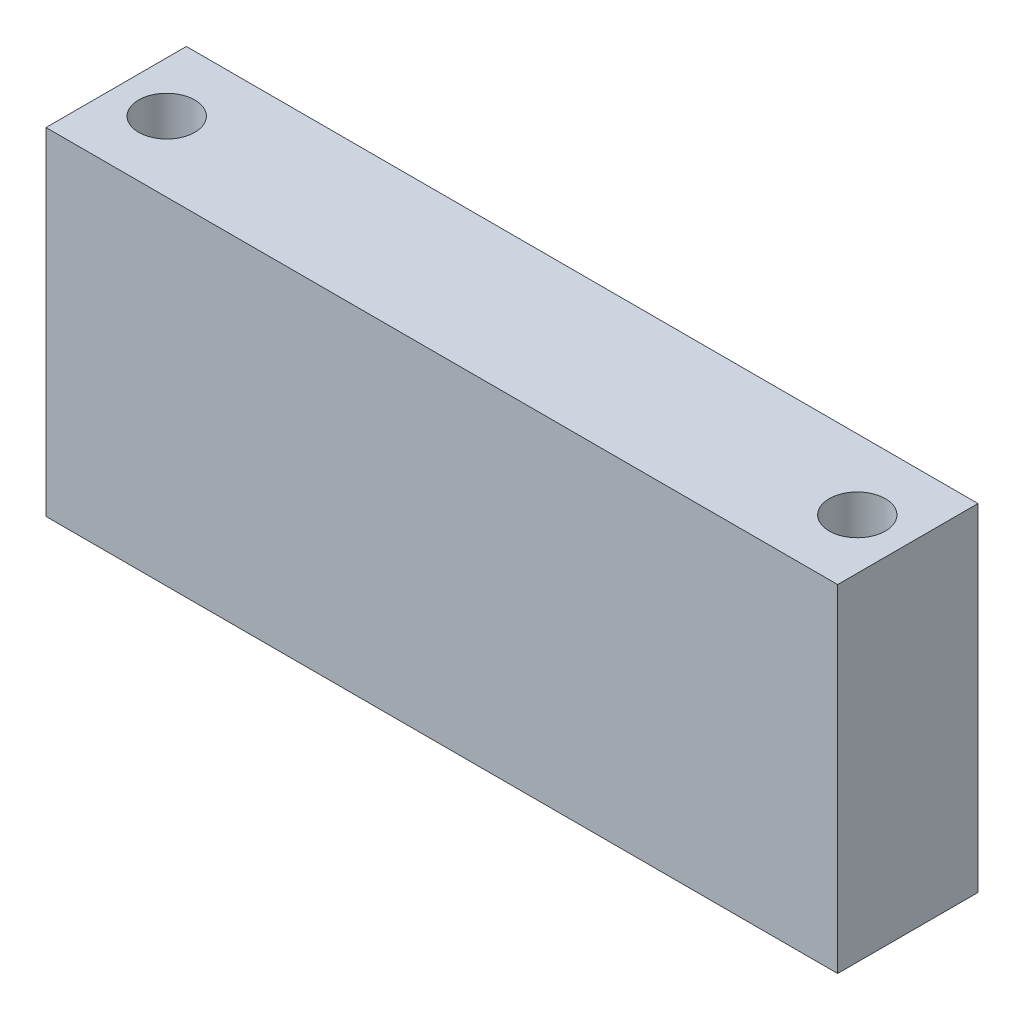
ISO-10303-21;
HEADER;
FILE_DESCRIPTION(('STEP AP214'),'2;1');
FILE_NAME('part.step','',(''),(''),'','','');
FILE_SCHEMA(('AUTOMOTIVE_DESIGN { 1 0 10303 214 1 1 1 1 }'));
ENDSEC;
DATA;
#1=APPLICATION_CONTEXT('core data for automotive mechanical design processes');
#2=APPLICATION_PROTOCOL_DEFINITION('international standard','automotive_design',2000,#1);
#3=PRODUCT_CONTEXT('',#1,'mechanical');
#4=PRODUCT('Part','Part','',(#3));
#5=PRODUCT_RELATED_PRODUCT_CATEGORY('part','',(#4));
#6=PRODUCT_DEFINITION_FORMATION('','',#4);
#7=PRODUCT_DEFINITION_CONTEXT('part definition',#1,'design');
#8=PRODUCT_DEFINITION('design','',#6,#7);
#9=PRODUCT_DEFINITION_SHAPE('','',#8);
#10=(LENGTH_UNIT() NAMED_UNIT(*) SI_UNIT(.MILLI.,.METRE.));
#11=(NAMED_UNIT(*) PLANE_ANGLE_UNIT() SI_UNIT($,.RADIAN.));
#12=(NAMED_UNIT(*) SI_UNIT($,.STERADIAN.) SOLID_ANGLE_UNIT());
#13=UNCERTAINTY_MEASURE_WITH_UNIT(LENGTH_MEASURE(1.E-05),#10,'distance_accuracy_value','');
#14=(GEOMETRIC_REPRESENTATION_CONTEXT(3) GLOBAL_UNCERTAINTY_ASSIGNED_CONTEXT((#13)) GLOBAL_UNIT_ASSIGNED_CONTEXT((#10,
#11,#12)) REPRESENTATION_CONTEXT('',''));
#15=CARTESIAN_POINT('',(0.,0.,0.));
#16=DIRECTION('',(0.,0.,1.));
#17=DIRECTION('',(1.,0.,0.));
#18=AXIS2_PLACEMENT_3D('',#15,#16,#17);
#19=CARTESIAN_POINT('',(0.,15.24,0.));
#20=DIRECTION('',(1.,0.,0.));
#21=DIRECTION('',(0.,0.,-1.));
#22=AXIS2_PLACEMENT_3D('',#19,#20,#21);
#23=PLANE('',#22);
#24=DIRECTION('',(0.,0.,1.));
#25=VECTOR('',#24,1.);
#26=CARTESIAN_POINT('',(0.,0.,0.));
#27=LINE('',#26,#25);
#28=CARTESIAN_POINT('',(0.,0.,-6.35));
#29=VERTEX_POINT('',#28);
#30=CARTESIAN_POINT('',(0.,0.,0.));
#31=VERTEX_POINT('',#30);
#32=EDGE_CURVE('E101',#29,#31,#27,.T.);
#33=ORIENTED_EDGE('',*,*,#32,.T.);
#34=DIRECTION('',(0.,-1.,0.));
#35=VECTOR('',#34,1.);
#36=CARTESIAN_POINT('',(0.,15.24,0.));
#37=LINE('',#36,#35);
#38=CARTESIAN_POINT('',(0.,15.24,0.));
#39=VERTEX_POINT('',#38);
#40=EDGE_CURVE('E11',#39,#31,#37,.T.);
#41=ORIENTED_EDGE('',*,*,#40,.F.);
#42=DIRECTION('',(0.,0.,1.));
#43=VECTOR('',#42,1.);
#44=CARTESIAN_POINT('',(0.,15.24,0.));
#45=LINE('',#44,#43);
#46=CARTESIAN_POINT('',(0.,15.24,-6.35));
#47=VERTEX_POINT('',#46);
#48=EDGE_CURVE('E89',#47,#39,#45,.T.);
#49=ORIENTED_EDGE('',*,*,#48,.F.);
#50=DIRECTION('',(0.,-1.,0.));
#51=VECTOR('',#50,1.);
#52=CARTESIAN_POINT('',(0.,15.24,-6.35));
#53=LINE('',#52,#51);
#54=EDGE_CURVE('E97',#47,#29,#53,.T.);
#55=ORIENTED_EDGE('',*,*,#54,.T.);
#56=EDGE_LOOP('',(#33,#41,#49,#55));
#57=FACE_BOUND('',#56,.T.);
#58=ADVANCED_FACE('F38',(#57),#23,.F.);
#59=CARTESIAN_POINT('',(0.,15.24,0.));
#60=DIRECTION('',(0.,0.,-1.));
#61=DIRECTION('',(-1.,0.,0.));
#62=AXIS2_PLACEMENT_3D('',#59,#60,#61);
#63=PLANE('',#62);
#64=DIRECTION('',(1.,0.,0.));
#65=VECTOR('',#64,1.);
#66=CARTESIAN_POINT('',(0.,0.,0.));
#67=LINE('',#66,#65);
#68=CARTESIAN_POINT('',(35.814,0.,0.));
#69=VERTEX_POINT('',#68);
#70=EDGE_CURVE('E93',#31,#69,#67,.T.);
#71=ORIENTED_EDGE('',*,*,#70,.T.);
#72=DIRECTION('',(0.,-1.,0.));
#73=VECTOR('',#72,1.);
#74=CARTESIAN_POINT('',(35.814,15.24,0.));
#75=LINE('',#74,#73);
#76=CARTESIAN_POINT('',(35.814,15.24,0.));
#77=VERTEX_POINT('',#76);
#78=EDGE_CURVE('E46',#77,#69,#75,.T.);
#79=ORIENTED_EDGE('',*,*,#78,.F.);
#80=DIRECTION('',(1.,0.,0.));
#81=VECTOR('',#80,1.);
#82=CARTESIAN_POINT('',(0.,15.24,0.));
#83=LINE('',#82,#81);
#84=EDGE_CURVE('E84',#39,#77,#83,.T.);
#85=ORIENTED_EDGE('',*,*,#84,.F.);
#86=ORIENTED_EDGE('',*,*,#40,.T.);
#87=EDGE_LOOP('',(#71,#79,#85,#86));
#88=FACE_BOUND('',#87,.T.);
#89=ADVANCED_FACE('F92',(#88),#63,.F.);
#90=CARTESIAN_POINT('',(35.814,15.24,0.));
#91=DIRECTION('',(-1.,0.,0.));
#92=DIRECTION('',(0.,0.,1.));
#93=AXIS2_PLACEMENT_3D('',#90,#91,#92);
#94=PLANE('',#93);
#95=DIRECTION('',(0.,0.,-1.));
#96=VECTOR('',#95,1.);
#97=CARTESIAN_POINT('',(35.814,0.,0.));
#98=LINE('',#97,#96);
#99=CARTESIAN_POINT('',(35.814,0.,-6.35));
#100=VERTEX_POINT('',#99);
#101=EDGE_CURVE('E71',#69,#100,#98,.T.);
#102=ORIENTED_EDGE('',*,*,#101,.T.);
#103=DIRECTION('',(0.,-1.,0.));
#104=VECTOR('',#103,1.);
#105=CARTESIAN_POINT('',(35.814,15.24,-6.35));
#106=LINE('',#105,#104);
#107=CARTESIAN_POINT('',(35.814,15.24,-6.35));
#108=VERTEX_POINT('',#107);
#109=EDGE_CURVE('E94',#108,#100,#106,.T.);
#110=ORIENTED_EDGE('',*,*,#109,.F.);
#111=DIRECTION('',(0.,0.,-1.));
#112=VECTOR('',#111,1.);
#113=CARTESIAN_POINT('',(35.814,15.24,0.));
#114=LINE('',#113,#112);
#115=EDGE_CURVE('E87',#77,#108,#114,.T.);
#116=ORIENTED_EDGE('',*,*,#115,.F.);
#117=ORIENTED_EDGE('',*,*,#78,.T.);
#118=EDGE_LOOP('',(#102,#110,#116,#117));
#119=FACE_BOUND('',#118,.T.);
#120=ADVANCED_FACE('F95',(#119),#94,.F.);
#121=CARTESIAN_POINT('',(0.,15.24,-6.35));
#122=DIRECTION('',(0.,0.,1.));
#123=DIRECTION('',(1.,0.,0.));
#124=AXIS2_PLACEMENT_3D('',#121,#122,#123);
#125=PLANE('',#124);
#126=DIRECTION('',(-1.,0.,0.));
#127=VECTOR('',#126,1.);
#128=CARTESIAN_POINT('',(0.,0.,-6.35));
#129=LINE('',#128,#127);
#130=EDGE_CURVE('E77',#100,#29,#129,.T.);
#131=ORIENTED_EDGE('',*,*,#130,.T.);
#132=ORIENTED_EDGE('',*,*,#54,.F.);
#133=DIRECTION('',(-1.,0.,0.));
#134=VECTOR('',#133,1.);
#135=CARTESIAN_POINT('',(0.,15.24,-6.35));
#136=LINE('',#135,#134);
#137=EDGE_CURVE('E54',#108,#47,#136,.T.);
#138=ORIENTED_EDGE('',*,*,#137,.F.);
#139=ORIENTED_EDGE('',*,*,#109,.T.);
#140=EDGE_LOOP('',(#131,#132,#138,#139));
#141=FACE_BOUND('',#140,.T.);
#142=ADVANCED_FACE('F109',(#141),#125,.F.);
#143=CARTESIAN_POINT('',(0.,15.24,0.));
#144=DIRECTION('',(0.,-1.,0.));
#145=DIRECTION('',(0.,0.,-1.));
#146=AXIS2_PLACEMENT_3D('',#143,#144,#145);
#147=PLANE('',#146);
#148=CARTESIAN_POINT('',(2.286,15.24,-3.175));
#149=DIRECTION('',(0.,-1.,0.));
#150=DIRECTION('',(0.,0.,-1.));
#151=AXIS2_PLACEMENT_3D('',#148,#149,#150);
#152=CIRCLE('',#151,1.27);
#153=CARTESIAN_POINT('',(2.286,15.24,-4.445));
#154=VERTEX_POINT('',#153);
#155=EDGE_CURVE('E104',#154,#154,#152,.T.);
#156=ORIENTED_EDGE('',*,*,#155,.T.);
#157=EDGE_LOOP('',(#156));
#158=FACE_BOUND('',#157,.T.);
#159=CARTESIAN_POINT('',(33.528,15.24,-3.175));
#160=DIRECTION('',(0.,-1.,0.));
#161=DIRECTION('',(0.,0.,-1.));
#162=AXIS2_PLACEMENT_3D('',#159,#160,#161);
#163=CIRCLE('',#162,1.27);
#164=CARTESIAN_POINT('',(33.528,15.24,-4.445));
#165=VERTEX_POINT('',#164);
#166=EDGE_CURVE('E118',#165,#165,#163,.T.);
#167=ORIENTED_EDGE('',*,*,#166,.T.);
#168=EDGE_LOOP('',(#167));
#169=FACE_BOUND('',#168,.T.);
#170=ORIENTED_EDGE('',*,*,#48,.T.);
#171=ORIENTED_EDGE('',*,*,#84,.T.);
#172=ORIENTED_EDGE('',*,*,#115,.T.);
#173=ORIENTED_EDGE('',*,*,#137,.T.);
#174=EDGE_LOOP('',(#170,#171,#172,#173));
#175=FACE_BOUND('',#174,.T.);
#176=ADVANCED_FACE('F85',(#158,#169,#175),#147,.F.);
#177=CARTESIAN_POINT('',(0.,0.,0.));
#178=DIRECTION('',(0.,-1.,0.));
#179=DIRECTION('',(0.,0.,-1.));
#180=AXIS2_PLACEMENT_3D('',#177,#178,#179);
#181=PLANE('',#180);
#182=CARTESIAN_POINT('',(2.286,0.,-3.175));
#183=DIRECTION('',(0.,-1.,0.));
#184=DIRECTION('',(0.,0.,-1.));
#185=AXIS2_PLACEMENT_3D('',#182,#183,#184);
#186=CIRCLE('',#185,1.27);
#187=CARTESIAN_POINT('',(2.286,0.,-4.445));
#188=VERTEX_POINT('',#187);
#189=EDGE_CURVE('E121',#188,#188,#186,.T.);
#190=ORIENTED_EDGE('',*,*,#189,.F.);
#191=EDGE_LOOP('',(#190));
#192=FACE_BOUND('',#191,.T.);
#193=CARTESIAN_POINT('',(33.528,0.,-3.175));
#194=DIRECTION('',(0.,-1.,0.));
#195=DIRECTION('',(0.,0.,-1.));
#196=AXIS2_PLACEMENT_3D('',#193,#194,#195);
#197=CIRCLE('',#196,1.27);
#198=CARTESIAN_POINT('',(33.528,0.,-4.445));
#199=VERTEX_POINT('',#198);
#200=EDGE_CURVE('E115',#199,#199,#197,.T.);
#201=ORIENTED_EDGE('',*,*,#200,.F.);
#202=EDGE_LOOP('',(#201));
#203=FACE_BOUND('',#202,.T.);
#204=ORIENTED_EDGE('',*,*,#32,.F.);
#205=ORIENTED_EDGE('',*,*,#130,.F.);
#206=ORIENTED_EDGE('',*,*,#101,.F.);
#207=ORIENTED_EDGE('',*,*,#70,.F.);
#208=EDGE_LOOP('',(#204,#205,#206,#207));
#209=FACE_BOUND('',#208,.T.);
#210=ADVANCED_FACE('F112',(#192,#203,#209),#181,.T.);
#211=CARTESIAN_POINT('',(33.528,15.24,-3.175));
#212=DIRECTION('',(0.,-1.,0.));
#213=DIRECTION('',(0.,0.,-1.));
#214=AXIS2_PLACEMENT_3D('',#211,#212,#213);
#215=CYLINDRICAL_SURFACE('',#214,1.27);
#216=CARTESIAN_POINT('',(33.528,15.24,-4.445));
#217=CARTESIAN_POINT('',(33.528,15.08125,-4.445));
#218=CARTESIAN_POINT('',(33.528,14.9225,-4.445));
#219=CARTESIAN_POINT('',(33.528,14.605,-4.445));
#220=CARTESIAN_POINT('',(33.528,14.44625,-4.445));
#221=CARTESIAN_POINT('',(33.528,14.12875,-4.445));
#222=CARTESIAN_POINT('',(33.528,13.97,-4.445));
#223=CARTESIAN_POINT('',(33.528,13.6525,-4.445));
#224=CARTESIAN_POINT('',(33.528,13.49375,-4.445));
#225=CARTESIAN_POINT('',(33.528,13.17625,-4.445));
#226=CARTESIAN_POINT('',(33.528,13.0175,-4.445));
#227=CARTESIAN_POINT('',(33.528,12.7,-4.445));
#228=CARTESIAN_POINT('',(33.528,12.54125,-4.445));
#229=CARTESIAN_POINT('',(33.528,12.22375,-4.445));
#230=CARTESIAN_POINT('',(33.528,12.065,-4.445));
#231=CARTESIAN_POINT('',(33.528,11.7475,-4.445));
#232=CARTESIAN_POINT('',(33.528,11.58875,-4.445));
#233=CARTESIAN_POINT('',(33.528,11.27125,-4.445));
#234=CARTESIAN_POINT('',(33.528,11.1125,-4.445));
#235=CARTESIAN_POINT('',(33.528,10.795,-4.445));
#236=CARTESIAN_POINT('',(33.528,10.63625,-4.445));
#237=CARTESIAN_POINT('',(33.528,10.31875,-4.445));
#238=CARTESIAN_POINT('',(33.528,10.16,-4.445));
#239=CARTESIAN_POINT('',(33.528,9.8425,-4.445));
#240=CARTESIAN_POINT('',(33.528,9.68375,-4.445));
#241=CARTESIAN_POINT('',(33.528,9.36625,-4.445));
#242=CARTESIAN_POINT('',(33.528,9.2075,-4.445));
#243=CARTESIAN_POINT('',(33.528,8.89,-4.445));
#244=CARTESIAN_POINT('',(33.528,8.73125,-4.445));
#245=CARTESIAN_POINT('',(33.528,8.41375,-4.445));
#246=CARTESIAN_POINT('',(33.528,8.255,-4.445));
#247=CARTESIAN_POINT('',(33.528,7.9375,-4.445));
#248=CARTESIAN_POINT('',(33.528,7.77875,-4.445));
#249=CARTESIAN_POINT('',(33.528,7.46125,-4.445));
#250=CARTESIAN_POINT('',(33.528,7.3025,-4.445));
#251=CARTESIAN_POINT('',(33.528,6.985,-4.445));
#252=CARTESIAN_POINT('',(33.528,6.82625,-4.445));
#253=CARTESIAN_POINT('',(33.528,6.50875,-4.445));
#254=CARTESIAN_POINT('',(33.528,6.35,-4.445));
#255=CARTESIAN_POINT('',(33.528,6.0325,-4.445));
#256=CARTESIAN_POINT('',(33.528,5.87375,-4.445));
#257=CARTESIAN_POINT('',(33.528,5.55625,-4.445));
#258=CARTESIAN_POINT('',(33.528,5.3975,-4.445));
#259=CARTESIAN_POINT('',(33.528,5.08,-4.445));
#260=CARTESIAN_POINT('',(33.528,4.92125,-4.445));
#261=CARTESIAN_POINT('',(33.528,4.60375,-4.445));
#262=CARTESIAN_POINT('',(33.528,4.445,-4.445));
#263=CARTESIAN_POINT('',(33.528,4.1275,-4.445));
#264=CARTESIAN_POINT('',(33.528,3.96875,-4.445));
#265=CARTESIAN_POINT('',(33.528,3.65125,-4.445));
#266=CARTESIAN_POINT('',(33.528,3.4925,-4.445));
#267=CARTESIAN_POINT('',(33.528,3.175,-4.445));
#268=CARTESIAN_POINT('',(33.528,3.01625,-4.445));
#269=CARTESIAN_POINT('',(33.528,2.69875,-4.445));
#270=CARTESIAN_POINT('',(33.528,2.54,-4.445));
#271=CARTESIAN_POINT('',(33.528,2.2225,-4.445));
#272=CARTESIAN_POINT('',(33.528,2.06375,-4.445));
#273=CARTESIAN_POINT('',(33.528,1.74625,-4.445));
#274=CARTESIAN_POINT('',(33.528,1.5875,-4.445));
#275=CARTESIAN_POINT('',(33.528,1.27,-4.445));
#276=CARTESIAN_POINT('',(33.528,1.11125,-4.445));
#277=CARTESIAN_POINT('',(33.528,0.79375,-4.445));
#278=CARTESIAN_POINT('',(33.528,0.634999999999999,-4.445));
#279=CARTESIAN_POINT('',(33.528,0.3175,-4.445));
#280=CARTESIAN_POINT('',(33.528,0.15875,-4.445));
#281=CARTESIAN_POINT('',(33.528,0.,-4.445));
#282=B_SPLINE_CURVE_WITH_KNOTS('',3,(#216,#217,#218,#219,#220,#221,#222,#223,#224,#225,#226,
#227,#228,#229,#230,#231,#232,#233,#234,#235,#236,#237,#238,#239,#240,#241,#242,#243,#244,#245,
#246,#247,#248,#249,#250,#251,#252,#253,#254,#255,#256,#257,#258,#259,#260,#261,#262,#263,#264,
#265,#266,#267,#268,#269,#270,#271,#272,#273,#274,#275,#276,#277,#278,#279,#280,#281),
.UNSPECIFIED.,.F.,.F.,(4,2,2,2,2,2,2,2,2,2,2,2,2,2,2,2,2,2,2,2,2,2,2,2,2,2,2,2,2,2,2,2,4),(0.,
0.476249999999999,0.952499999999998,1.42875,1.905,2.38125,2.8575,3.33375,3.81,4.28625,4.7625,
5.23875,5.715,6.19125,6.6675,7.14375,7.62,8.09625,8.5725,9.04875,9.525,10.00125,10.4775,
10.95375,11.43,11.90625,12.3825,12.85875,13.335,13.81125,14.2875,14.76375,15.24),.UNSPECIFIED.);
#283=EDGE_CURVE('BSEAM132',#165,#199,#282,.T.);
#284=ORIENTED_EDGE('',*,*,#166,.F.);
#285=ORIENTED_EDGE('',*,*,#200,.T.);
#286=ORIENTED_EDGE('',*,*,#283,.T.);
#287=ORIENTED_EDGE('',*,*,#283,.F.);
#288=EDGE_LOOP('',(#284,#286,#285,#287));
#289=FACE_BOUND('',#288,.T.);
#290=ADVANCED_FACE('F132',(#289),#215,.F.);
#291=CARTESIAN_POINT('',(2.286,15.24,-3.175));
#292=DIRECTION('',(0.,-1.,0.));
#293=DIRECTION('',(0.,0.,-1.));
#294=AXIS2_PLACEMENT_3D('',#291,#292,#293);
#295=CYLINDRICAL_SURFACE('',#294,1.27);
#296=CARTESIAN_POINT('',(2.286,15.24,-4.445));
#297=CARTESIAN_POINT('',(2.286,15.08125,-4.445));
#298=CARTESIAN_POINT('',(2.286,14.9225,-4.445));
#299=CARTESIAN_POINT('',(2.286,14.605,-4.445));
#300=CARTESIAN_POINT('',(2.286,14.44625,-4.445));
#301=CARTESIAN_POINT('',(2.286,14.12875,-4.445));
#302=CARTESIAN_POINT('',(2.286,13.97,-4.445));
#303=CARTESIAN_POINT('',(2.286,13.6525,-4.445));
#304=CARTESIAN_POINT('',(2.286,13.49375,-4.445));
#305=CARTESIAN_POINT('',(2.286,13.17625,-4.445));
#306=CARTESIAN_POINT('',(2.286,13.0175,-4.445));
#307=CARTESIAN_POINT('',(2.286,12.7,-4.445));
#308=CARTESIAN_POINT('',(2.286,12.54125,-4.445));
#309=CARTESIAN_POINT('',(2.286,12.22375,-4.445));
#310=CARTESIAN_POINT('',(2.286,12.065,-4.445));
#311=CARTESIAN_POINT('',(2.286,11.7475,-4.445));
#312=CARTESIAN_POINT('',(2.286,11.58875,-4.445));
#313=CARTESIAN_POINT('',(2.286,11.27125,-4.445));
#314=CARTESIAN_POINT('',(2.286,11.1125,-4.445));
#315=CARTESIAN_POINT('',(2.286,10.795,-4.445));
#316=CARTESIAN_POINT('',(2.286,10.63625,-4.445));
#317=CARTESIAN_POINT('',(2.286,10.31875,-4.445));
#318=CARTESIAN_POINT('',(2.286,10.16,-4.445));
#319=CARTESIAN_POINT('',(2.286,9.8425,-4.445));
#320=CARTESIAN_POINT('',(2.286,9.68375,-4.445));
#321=CARTESIAN_POINT('',(2.286,9.36625,-4.445));
#322=CARTESIAN_POINT('',(2.286,9.2075,-4.445));
#323=CARTESIAN_POINT('',(2.286,8.89,-4.445));
#324=CARTESIAN_POINT('',(2.286,8.73125,-4.445));
#325=CARTESIAN_POINT('',(2.286,8.41375,-4.445));
#326=CARTESIAN_POINT('',(2.286,8.255,-4.445));
#327=CARTESIAN_POINT('',(2.286,7.9375,-4.445));
#328=CARTESIAN_POINT('',(2.286,7.77875,-4.445));
#329=CARTESIAN_POINT('',(2.286,7.46125,-4.445));
#330=CARTESIAN_POINT('',(2.286,7.3025,-4.445));
#331=CARTESIAN_POINT('',(2.286,6.985,-4.445));
#332=CARTESIAN_POINT('',(2.286,6.82625,-4.445));
#333=CARTESIAN_POINT('',(2.286,6.50875,-4.445));
#334=CARTESIAN_POINT('',(2.286,6.35,-4.445));
#335=CARTESIAN_POINT('',(2.286,6.0325,-4.445));
#336=CARTESIAN_POINT('',(2.286,5.87375,-4.445));
#337=CARTESIAN_POINT('',(2.286,5.55625,-4.445));
#338=CARTESIAN_POINT('',(2.286,5.3975,-4.445));
#339=CARTESIAN_POINT('',(2.286,5.08,-4.445));
#340=CARTESIAN_POINT('',(2.286,4.92125,-4.445));
#341=CARTESIAN_POINT('',(2.286,4.60375,-4.445));
#342=CARTESIAN_POINT('',(2.286,4.445,-4.445));
#343=CARTESIAN_POINT('',(2.286,4.1275,-4.445));
#344=CARTESIAN_POINT('',(2.286,3.96875,-4.445));
#345=CARTESIAN_POINT('',(2.286,3.65125,-4.445));
#346=CARTESIAN_POINT('',(2.286,3.4925,-4.445));
#347=CARTESIAN_POINT('',(2.286,3.175,-4.445));
#348=CARTESIAN_POINT('',(2.286,3.01625,-4.445));
#349=CARTESIAN_POINT('',(2.286,2.69875,-4.445));
#350=CARTESIAN_POINT('',(2.286,2.54,-4.445));
#351=CARTESIAN_POINT('',(2.286,2.2225,-4.445));
#352=CARTESIAN_POINT('',(2.286,2.06375,-4.445));
#353=CARTESIAN_POINT('',(2.286,1.74625,-4.445));
#354=CARTESIAN_POINT('',(2.286,1.5875,-4.445));
#355=CARTESIAN_POINT('',(2.286,1.27,-4.445));
#356=CARTESIAN_POINT('',(2.286,1.11125,-4.445));
#357=CARTESIAN_POINT('',(2.286,0.79375,-4.445));
#358=CARTESIAN_POINT('',(2.286,0.634999999999999,-4.445));
#359=CARTESIAN_POINT('',(2.286,0.3175,-4.445));
#360=CARTESIAN_POINT('',(2.286,0.15875,-4.445));
#361=CARTESIAN_POINT('',(2.286,0.,-4.445));
#362=B_SPLINE_CURVE_WITH_KNOTS('',3,(#296,#297,#298,#299,#300,#301,#302,#303,#304,#305,#306,
#307,#308,#309,#310,#311,#312,#313,#314,#315,#316,#317,#318,#319,#320,#321,#322,#323,#324,#325,
#326,#327,#328,#329,#330,#331,#332,#333,#334,#335,#336,#337,#338,#339,#340,#341,#342,#343,#344,
#345,#346,#347,#348,#349,#350,#351,#352,#353,#354,#355,#356,#357,#358,#359,#360,#361),
.UNSPECIFIED.,.F.,.F.,(4,2,2,2,2,2,2,2,2,2,2,2,2,2,2,2,2,2,2,2,2,2,2,2,2,2,2,2,2,2,2,2,4),(0.,
0.476249999999999,0.952499999999998,1.42875,1.905,2.38125,2.8575,3.33375,3.81,4.28625,4.7625,
5.23875,5.715,6.19125,6.6675,7.14375,7.62,8.09625,8.5725,9.04875,9.525,10.00125,10.4775,
10.95375,11.43,11.90625,12.3825,12.85875,13.335,13.81125,14.2875,14.76375,15.24),.UNSPECIFIED.);
#363=EDGE_CURVE('BSEAM129',#154,#188,#362,.T.);
#364=ORIENTED_EDGE('',*,*,#155,.F.);
#365=ORIENTED_EDGE('',*,*,#189,.T.);
#366=ORIENTED_EDGE('',*,*,#363,.T.);
#367=ORIENTED_EDGE('',*,*,#363,.F.);
#368=EDGE_LOOP('',(#364,#366,#365,#367));
#369=FACE_BOUND('',#368,.T.);
#370=ADVANCED_FACE('F129',(#369),#295,.F.);
#371=CLOSED_SHELL('',(#58,#89,#120,#142,#176,#210,#290,#370));
#372=MANIFOLD_SOLID_BREP('B2',#371);
#373=ADVANCED_BREP_SHAPE_REPRESENTATION('',(#18,#372),#14);
#374=SHAPE_DEFINITION_REPRESENTATION(#9,#373);
ENDSEC;
END-ISO-10303-21;
